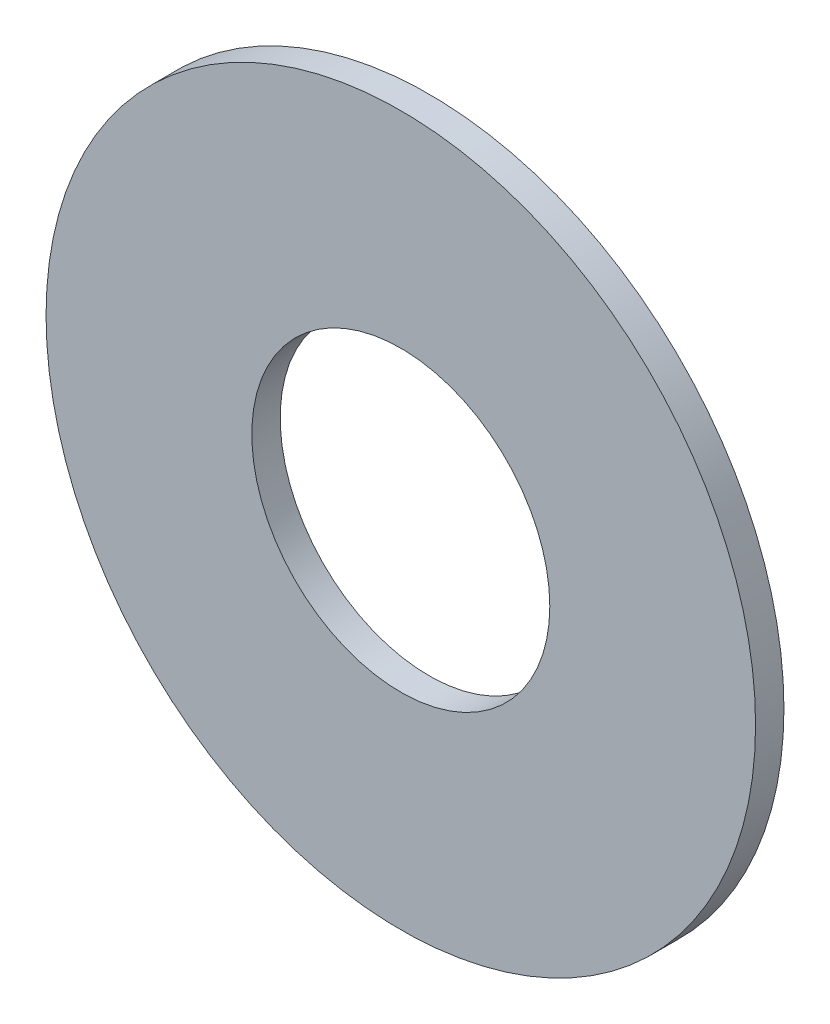
ISO-10303-21;
HEADER;
FILE_DESCRIPTION(('STEP AP214'),'2;1');
FILE_NAME('part.step','',(''),(''),'','','');
FILE_SCHEMA(('AUTOMOTIVE_DESIGN { 1 0 10303 214 1 1 1 1 }'));
ENDSEC;
DATA;
#1=APPLICATION_CONTEXT('core data for automotive mechanical design processes');
#2=APPLICATION_PROTOCOL_DEFINITION('international standard','automotive_design',2000,#1);
#3=PRODUCT_CONTEXT('',#1,'mechanical');
#4=PRODUCT('Part','Part','',(#3));
#5=PRODUCT_RELATED_PRODUCT_CATEGORY('part','',(#4));
#6=PRODUCT_DEFINITION_FORMATION('','',#4);
#7=PRODUCT_DEFINITION_CONTEXT('part definition',#1,'design');
#8=PRODUCT_DEFINITION('design','',#6,#7);
#9=PRODUCT_DEFINITION_SHAPE('','',#8);
#10=(LENGTH_UNIT() NAMED_UNIT(*) SI_UNIT(.MILLI.,.METRE.));
#11=(NAMED_UNIT(*) PLANE_ANGLE_UNIT() SI_UNIT($,.RADIAN.));
#12=(NAMED_UNIT(*) SI_UNIT($,.STERADIAN.) SOLID_ANGLE_UNIT());
#13=UNCERTAINTY_MEASURE_WITH_UNIT(LENGTH_MEASURE(1.E-05),#10,'distance_accuracy_value','');
#14=(GEOMETRIC_REPRESENTATION_CONTEXT(3) GLOBAL_UNCERTAINTY_ASSIGNED_CONTEXT((#13)) GLOBAL_UNIT_ASSIGNED_CONTEXT((#10,
#11,#12)) REPRESENTATION_CONTEXT('',''));
#15=CARTESIAN_POINT('',(0.,0.,0.));
#16=DIRECTION('',(0.,0.,1.));
#17=DIRECTION('',(1.,0.,0.));
#18=AXIS2_PLACEMENT_3D('',#15,#16,#17);
#19=CARTESIAN_POINT('',(0.,0.,0.2));
#20=DIRECTION('',(0.,0.,1.));
#21=DIRECTION('',(1.,0.,0.));
#22=AXIS2_PLACEMENT_3D('',#19,#20,#21);
#23=PLANE('',#22);
#24=CARTESIAN_POINT('',(0.,0.,0.2));
#25=DIRECTION('',(0.,0.,1.));
#26=DIRECTION('',(1.,0.,0.));
#27=AXIS2_PLACEMENT_3D('',#24,#25,#26);
#28=CIRCLE('',#27,2.5);
#29=CARTESIAN_POINT('',(2.5,0.,0.2));
#30=VERTEX_POINT('',#29);
#31=EDGE_CURVE('E10',#30,#30,#28,.T.);
#32=ORIENTED_EDGE('',*,*,#31,.T.);
#33=EDGE_LOOP('',(#32));
#34=FACE_BOUND('',#33,.T.);
#35=CARTESIAN_POINT('',(0.,0.,0.2));
#36=DIRECTION('',(0.,0.,1.));
#37=DIRECTION('',(1.,0.,0.));
#38=AXIS2_PLACEMENT_3D('',#35,#36,#37);
#39=CIRCLE('',#38,1.05);
#40=CARTESIAN_POINT('',(1.05,0.,0.2));
#41=VERTEX_POINT('',#40);
#42=EDGE_CURVE('E43',#41,#41,#39,.T.);
#43=ORIENTED_EDGE('',*,*,#42,.F.);
#44=EDGE_LOOP('',(#43));
#45=FACE_BOUND('',#44,.T.);
#46=ADVANCED_FACE('F32',(#34,#45),#23,.T.);
#47=CARTESIAN_POINT('',(0.,0.,0.));
#48=DIRECTION('',(0.,0.,1.));
#49=DIRECTION('',(1.,0.,0.));
#50=AXIS2_PLACEMENT_3D('',#47,#48,#49);
#51=PLANE('',#50);
#52=CARTESIAN_POINT('',(0.,0.,0.));
#53=DIRECTION('',(0.,0.,1.));
#54=DIRECTION('',(1.,0.,0.));
#55=AXIS2_PLACEMENT_3D('',#52,#53,#54);
#56=CIRCLE('',#55,2.5);
#57=CARTESIAN_POINT('',(2.5,0.,0.));
#58=VERTEX_POINT('',#57);
#59=EDGE_CURVE('E36',#58,#58,#56,.T.);
#60=ORIENTED_EDGE('',*,*,#59,.F.);
#61=EDGE_LOOP('',(#60));
#62=FACE_BOUND('',#61,.T.);
#63=CARTESIAN_POINT('',(0.,0.,0.));
#64=DIRECTION('',(0.,0.,1.));
#65=DIRECTION('',(1.,0.,0.));
#66=AXIS2_PLACEMENT_3D('',#63,#64,#65);
#67=CIRCLE('',#66,1.05);
#68=CARTESIAN_POINT('',(1.05,0.,0.));
#69=VERTEX_POINT('',#68);
#70=EDGE_CURVE('E45',#69,#69,#67,.T.);
#71=ORIENTED_EDGE('',*,*,#70,.T.);
#72=EDGE_LOOP('',(#71));
#73=FACE_BOUND('',#72,.T.);
#74=ADVANCED_FACE('F55',(#62,#73),#51,.F.);
#75=CARTESIAN_POINT('',(0.,0.,0.2));
#76=DIRECTION('',(0.,0.,-1.));
#77=DIRECTION('',(-1.,0.,0.));
#78=AXIS2_PLACEMENT_3D('',#75,#76,#77);
#79=CYLINDRICAL_SURFACE('',#78,2.5);
#80=ORIENTED_EDGE('',*,*,#31,.F.);
#81=EDGE_LOOP('',(#80));
#82=FACE_BOUND('',#81,.T.);
#83=ORIENTED_EDGE('',*,*,#59,.T.);
#84=EDGE_LOOP('',(#83));
#85=FACE_BOUND('',#84,.T.);
#86=ADVANCED_FACE('F34',(#82,#85),#79,.T.);
#87=CARTESIAN_POINT('',(0.,0.,0.2));
#88=DIRECTION('',(0.,0.,-1.));
#89=DIRECTION('',(-1.,0.,0.));
#90=AXIS2_PLACEMENT_3D('',#87,#88,#89);
#91=CYLINDRICAL_SURFACE('',#90,1.05);
#92=ORIENTED_EDGE('',*,*,#42,.T.);
#93=EDGE_LOOP('',(#92));
#94=FACE_BOUND('',#93,.T.);
#95=ORIENTED_EDGE('',*,*,#70,.F.);
#96=EDGE_LOOP('',(#95));
#97=FACE_BOUND('',#96,.T.);
#98=ADVANCED_FACE('F51',(#94,#97),#91,.F.);
#99=CLOSED_SHELL('',(#46,#74,#86,#98));
#100=MANIFOLD_SOLID_BREP('B2',#99);
#101=ADVANCED_BREP_SHAPE_REPRESENTATION('',(#18,#100),#14);
#102=SHAPE_DEFINITION_REPRESENTATION(#9,#101);
ENDSEC;
END-ISO-10303-21;
